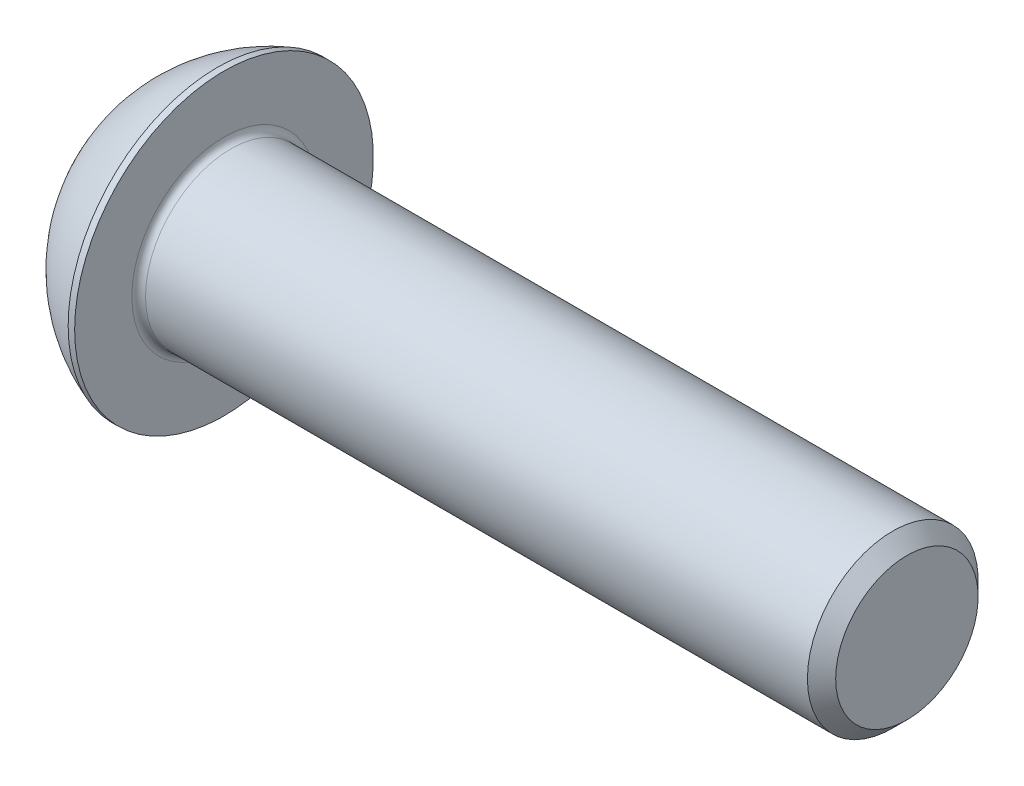
ISO-10303-21;
HEADER;
FILE_DESCRIPTION(('STEP AP214'),'2;1');
FILE_NAME('part.step','',(''),(''),'','','');
FILE_SCHEMA(('AUTOMOTIVE_DESIGN { 1 0 10303 214 1 1 1 1 }'));
ENDSEC;
DATA;
#1=APPLICATION_CONTEXT('core data for automotive mechanical design processes');
#2=APPLICATION_PROTOCOL_DEFINITION('international standard','automotive_design',2000,#1);
#3=PRODUCT_CONTEXT('',#1,'mechanical');
#4=PRODUCT('Part','Part','',(#3));
#5=PRODUCT_RELATED_PRODUCT_CATEGORY('part','',(#4));
#6=PRODUCT_DEFINITION_FORMATION('','',#4);
#7=PRODUCT_DEFINITION_CONTEXT('part definition',#1,'design');
#8=PRODUCT_DEFINITION('design','',#6,#7);
#9=PRODUCT_DEFINITION_SHAPE('','',#8);
#10=(LENGTH_UNIT() NAMED_UNIT(*) SI_UNIT(.MILLI.,.METRE.));
#11=(NAMED_UNIT(*) PLANE_ANGLE_UNIT() SI_UNIT($,.RADIAN.));
#12=(NAMED_UNIT(*) SI_UNIT($,.STERADIAN.) SOLID_ANGLE_UNIT());
#13=UNCERTAINTY_MEASURE_WITH_UNIT(LENGTH_MEASURE(1.E-05),#10,'distance_accuracy_value','');
#14=(GEOMETRIC_REPRESENTATION_CONTEXT(3) GLOBAL_UNCERTAINTY_ASSIGNED_CONTEXT((#13)) GLOBAL_UNIT_ASSIGNED_CONTEXT((#10,
#11,#12)) REPRESENTATION_CONTEXT('',''));
#15=CARTESIAN_POINT('',(0.,0.,0.));
#16=DIRECTION('',(0.,0.,1.));
#17=DIRECTION('',(1.,0.,0.));
#18=AXIS2_PLACEMENT_3D('',#15,#16,#17);
#19=CARTESIAN_POINT('',(0.,0.,0.));
#20=DIRECTION('',(-1.,0.,0.));
#21=DIRECTION('',(0.,0.,1.));
#22=AXIS2_PLACEMENT_3D('',#19,#20,#21);
#23=PLANE('',#22);
#24=CARTESIAN_POINT('',(0.,0.,0.));
#25=DIRECTION('',(-1.,0.,0.));
#26=DIRECTION('',(0.,0.,1.));
#27=AXIS2_PLACEMENT_3D('',#24,#25,#26);
#28=CIRCLE('',#27,4.375);
#29=CARTESIAN_POINT('',(0.,4.375,0.));
#30=VERTEX_POINT('',#29);
#31=EDGE_CURVE('E160',#30,#30,#28,.T.);
#32=ORIENTED_EDGE('',*,*,#31,.T.);
#33=EDGE_LOOP('',(#32));
#34=FACE_BOUND('',#33,.T.);
#35=DIRECTION('',(0.,-1.,0.));
#36=VECTOR('',#35,1.);
#37=CARTESIAN_POINT('',(0.,-1.73205080756888,3.));
#38=LINE('',#37,#36);
#39=CARTESIAN_POINT('',(0.,1.73205080756888,3.));
#40=VERTEX_POINT('',#39);
#41=CARTESIAN_POINT('',(0.,-1.73205080756888,3.));
#42=VERTEX_POINT('',#41);
#43=EDGE_CURVE('E50',#40,#42,#38,.T.);
#44=ORIENTED_EDGE('',*,*,#43,.T.);
#45=DIRECTION('',(0.,-0.5,-0.866025403784439));
#46=VECTOR('',#45,1.);
#47=CARTESIAN_POINT('',(0.,-3.46410161513775,0.));
#48=LINE('',#47,#46);
#49=CARTESIAN_POINT('',(0.,-3.46410161513775,0.));
#50=VERTEX_POINT('',#49);
#51=EDGE_CURVE('E253',#42,#50,#48,.T.);
#52=ORIENTED_EDGE('',*,*,#51,.T.);
#53=DIRECTION('',(0.,0.5,-0.866025403784439));
#54=VECTOR('',#53,1.);
#55=CARTESIAN_POINT('',(0.,-1.73205080756888,-3.));
#56=LINE('',#55,#54);
#57=CARTESIAN_POINT('',(0.,-1.73205080756888,-3.));
#58=VERTEX_POINT('',#57);
#59=EDGE_CURVE('E135',#50,#58,#56,.T.);
#60=ORIENTED_EDGE('',*,*,#59,.T.);
#61=DIRECTION('',(0.,1.,0.));
#62=VECTOR('',#61,1.);
#63=CARTESIAN_POINT('',(0.,1.73205080756888,-3.));
#64=LINE('',#63,#62);
#65=CARTESIAN_POINT('',(0.,1.73205080756888,-3.));
#66=VERTEX_POINT('',#65);
#67=EDGE_CURVE('E256',#58,#66,#64,.T.);
#68=ORIENTED_EDGE('',*,*,#67,.T.);
#69=DIRECTION('',(0.,0.5,0.866025403784439));
#70=VECTOR('',#69,1.);
#71=CARTESIAN_POINT('',(0.,3.46410161513775,0.));
#72=LINE('',#71,#70);
#73=CARTESIAN_POINT('',(0.,3.46410161513775,0.));
#74=VERTEX_POINT('',#73);
#75=EDGE_CURVE('E258',#66,#74,#72,.T.);
#76=ORIENTED_EDGE('',*,*,#75,.T.);
#77=DIRECTION('',(0.,-0.5,0.866025403784439));
#78=VECTOR('',#77,1.);
#79=CARTESIAN_POINT('',(0.,1.73205080756888,3.));
#80=LINE('',#79,#78);
#81=EDGE_CURVE('E260',#74,#40,#80,.T.);
#82=ORIENTED_EDGE('',*,*,#81,.T.);
#83=EDGE_LOOP('',(#44,#52,#60,#68,#76,#82));
#84=FACE_BOUND('',#83,.T.);
#85=ADVANCED_FACE('F35',(#34,#84),#23,.T.);
#86=CARTESIAN_POINT('',(8.16760498046876,0.,0.));
#87=DIRECTION('',(-1.,0.,0.));
#88=DIRECTION('',(0.,1.,0.));
#89=AXIS2_PLACEMENT_3D('',#86,#87,#88);
#90=SPHERICAL_SURFACE('',#89,9.26554888374014);
#91=CARTESIAN_POINT('',(5.12,0.,0.));
#92=DIRECTION('',(-1.,0.,0.));
#93=DIRECTION('',(0.,0.,1.));
#94=AXIS2_PLACEMENT_3D('',#91,#92,#93);
#95=CIRCLE('',#94,8.75);
#96=CARTESIAN_POINT('',(5.12,8.75,0.));
#97=VERTEX_POINT('',#96);
#98=EDGE_CURVE('E157',#97,#97,#95,.T.);
#99=CARTESIAN_POINT('',(5.12,8.75,0.));
#100=CARTESIAN_POINT('',(5.05219861122677,8.72638510285421,0.));
#101=CARTESIAN_POINT('',(4.98467181293709,8.70198184687029,0.));
#102=CARTESIAN_POINT('',(4.8502036366267,8.65161246981684,0.));
#103=CARTESIAN_POINT('',(4.78326225860599,8.62564634874731,0.));
#104=CARTESIAN_POINT('',(4.65000116213544,8.5721650941133,0.));
#105=CARTESIAN_POINT('',(4.5836814436856,8.54464996054882,0.));
#106=CARTESIAN_POINT('',(4.45169948497619,8.48808559682589,0.));
#107=CARTESIAN_POINT('',(4.38603724471662,8.45903636666746,0.));
#108=CARTESIAN_POINT('',(4.25540572844416,8.3994194939892,0.));
#109=CARTESIAN_POINT('',(4.19043645243127,8.36885185146938,0.));
#110=CARTESIAN_POINT('',(4.06122597017269,8.306214675037,0.));
#111=CARTESIAN_POINT('',(3.99698476392699,8.27414514112444,0.));
#112=CARTESIAN_POINT('',(3.86926513493406,8.20852151008421,0.));
#113=CARTESIAN_POINT('',(3.80578671218683,8.17496741295654,0.));
#114=CARTESIAN_POINT('',(3.67962695130739,8.10639278702893,0.));
#115=CARTESIAN_POINT('',(3.61694561317517,8.071372258229,0.));
#116=CARTESIAN_POINT('',(3.49241389204665,7.99988369258837,0.));
#117=CARTESIAN_POINT('',(3.43056350905033,7.96341565574768,0.));
#118=CARTESIAN_POINT('',(3.30772711966809,7.88905177991644,0.));
#119=CARTESIAN_POINT('',(3.24674111328216,7.8511559409259,0.));
#120=CARTESIAN_POINT('',(3.12566643152891,7.77395693819076,0.));
#121=CARTESIAN_POINT('',(3.06557775616159,7.73465377444616,0.));
#122=CARTESIAN_POINT('',(2.94633020596964,7.65466136006695,0.));
#123=CARTESIAN_POINT('',(2.887171331145,7.61397210943232,0.));
#124=CARTESIAN_POINT('',(2.76981534913594,7.53122950812154,0.));
#125=CARTESIAN_POINT('',(2.71161824195152,7.48917615744539,0.));
#126=CARTESIAN_POINT('',(2.59621724261937,7.40372808000575,0.));
#127=CARTESIAN_POINT('',(2.53901335047164,7.36033335324228,0.));
#128=CARTESIAN_POINT('',(2.42562969191559,7.27222597240825,0.));
#129=CARTESIAN_POINT('',(2.36944992550727,7.2275133183377,0.));
#130=CARTESIAN_POINT('',(2.25814487573602,7.13679424382519,0.));
#131=CARTESIAN_POINT('',(2.20301959237308,7.09078782338323,0.));
#132=CARTESIAN_POINT('',(2.093853296198,6.99750607616331,0.));
#133=CARTESIAN_POINT('',(2.03981228338585,6.95023074938535,0.));
#134=CARTESIAN_POINT('',(1.93284372992113,6.85443673519524,0.));
#135=CARTESIAN_POINT('',(1.87991618926856,6.8059180477831,0.));
#136=CARTESIAN_POINT('',(1.77520318005587,6.70766352988896,0.));
#137=CARTESIAN_POINT('',(1.72341771149575,6.65792769940695,0.));
#138=CARTESIAN_POINT('',(1.62101682927054,6.55726577063302,0.));
#139=CARTESIAN_POINT('',(1.57040141560546,6.5063396723411,0.));
#140=CARTESIAN_POINT('',(1.47036799372202,6.40332472638045,0.));
#141=CARTESIAN_POINT('',(1.42094998550366,6.35123587871174,0.));
#142=CARTESIAN_POINT('',(1.3233380780348,6.2459235807343,0.));
#143=CARTESIAN_POINT('',(1.27514417878429,6.19270013042558,0.));
#144=CARTESIAN_POINT('',(1.18000653131406,6.08514738699808,0.));
#145=CARTESIAN_POINT('',(1.13306278309434,6.0308180938793,0.));
#146=CARTESIAN_POINT('',(1.04045080421125,5.92108302221819,0.));
#147=CARTESIAN_POINT('',(0.994782573547891,5.86567724367586,0.));
#148=CARTESIAN_POINT('',(0.904746307085112,5.75381914023211,0.));
#149=CARTESIAN_POINT('',(0.860378271285698,5.69736681533071,0.));
#150=CARTESIAN_POINT('',(0.77296636920711,5.5834461237893,0.));
#151=CARTESIAN_POINT('',(0.729922502927938,5.52597775714929,0.));
#152=CARTESIAN_POINT('',(0.645182199308179,5.4100560356152,0.));
#153=CARTESIAN_POINT('',(0.603485761967592,5.35160268072112,0.));
#154=CARTESIAN_POINT('',(0.521462846462435,5.2337425690253,0.));
#155=CARTESIAN_POINT('',(0.481136368297864,5.17433581222357,0.));
#156=CARTESIAN_POINT('',(0.401875165156513,5.05460099594959,0.));
#157=CARTESIAN_POINT('',(0.362940440179733,4.99427293647735,0.));
#158=CARTESIAN_POINT('',(0.286483770279176,4.87272812047984,0.));
#159=CARTESIAN_POINT('',(0.248961825355399,4.81151136395457,0.));
#160=CARTESIAN_POINT('',(0.17535103536488,4.68822220779421,0.));
#161=CARTESIAN_POINT('',(0.139262190298139,4.62614980815913,0.));
#162=CARTESIAN_POINT('',(0.068536935138992,4.50118300109554,0.));
#163=CARTESIAN_POINT('',(0.0339005250465871,4.43828859366703,0.));
#164=CARTESIAN_POINT('',(0.,4.375,0.));
#165=B_SPLINE_CURVE_WITH_KNOTS('',3,(#99,#100,#101,#102,#103,#104,#105,#106,#107,#108,#109,#110,
#111,#112,#113,#114,#115,#116,#117,#118,#119,#120,#121,#122,#123,#124,#125,#126,#127,#128,#129,
#130,#131,#132,#133,#134,#135,#136,#137,#138,#139,#140,#141,#142,#143,#144,#145,#146,#147,#148,
#149,#150,#151,#152,#153,#154,#155,#156,#157,#158,#159,#160,#161,#162,#163,#164),.UNSPECIFIED.,
.F.,.F.,(4,2,2,2,2,2,2,2,2,2,2,2,2,2,2,2,2,2,2,2,2,2,2,2,2,2,2,2,2,2,2,2,4),(0.,
0.21538368408056,0.430767368161118,0.646151052241677,0.861534736322238,1.0769184204028,
1.29230210448335,1.50768578856391,1.72306947264447,1.93845315672503,2.15383684080559,
2.36922052488615,2.58460420896671,2.79998789304727,3.01537157712783,3.23075526120839,
3.44613894528894,3.6615226293695,3.87690631345006,4.09228999753062,4.30767368161118,
4.52305736569174,4.7384410497723,4.95382473385286,5.16920841793342,5.38459210201397,
5.59997578609453,5.81535947017509,6.03074315425565,6.24612683833621,6.46151052241677,
6.67689420649733,6.89227789057789),.UNSPECIFIED.);
#166=EDGE_CURVE('BSEAM181',#97,#30,#165,.T.);
#167=ORIENTED_EDGE('',*,*,#98,.T.);
#168=ORIENTED_EDGE('',*,*,#31,.F.);
#169=ORIENTED_EDGE('',*,*,#166,.T.);
#170=ORIENTED_EDGE('',*,*,#166,.F.);
#171=EDGE_LOOP('',(#167,#169,#168,#170));
#172=FACE_BOUND('',#171,.T.);
#173=ADVANCED_FACE('F181',(#172),#90,.T.);
#174=CARTESIAN_POINT('',(0.,0.,0.));
#175=DIRECTION('',(-1.,0.,0.));
#176=DIRECTION('',(0.,0.,1.));
#177=AXIS2_PLACEMENT_3D('',#174,#175,#176);
#178=CYLINDRICAL_SURFACE('',#177,8.75);
#179=ORIENTED_EDGE('',*,*,#98,.F.);
#180=EDGE_LOOP('',(#179));
#181=FACE_BOUND('',#180,.T.);
#182=CARTESIAN_POINT('',(5.5,0.,0.));
#183=DIRECTION('',(-1.,0.,0.));
#184=DIRECTION('',(0.,0.,1.));
#185=AXIS2_PLACEMENT_3D('',#182,#183,#184);
#186=CIRCLE('',#185,8.75);
#187=CARTESIAN_POINT('',(5.5,0.,8.75));
#188=VERTEX_POINT('',#187);
#189=EDGE_CURVE('E154',#188,#188,#186,.T.);
#190=ORIENTED_EDGE('',*,*,#189,.T.);
#191=EDGE_LOOP('',(#190));
#192=FACE_BOUND('',#191,.T.);
#193=ADVANCED_FACE('F186',(#181,#192),#178,.T.);
#194=CARTESIAN_POINT('',(5.5,5.,0.));
#195=DIRECTION('',(-1.,0.,0.));
#196=DIRECTION('',(0.,0.,1.));
#197=AXIS2_PLACEMENT_3D('',#194,#195,#196);
#198=PLANE('',#197);
#199=CARTESIAN_POINT('',(5.5,0.,0.));
#200=DIRECTION('',(-1.,0.,0.));
#201=DIRECTION('',(0.,0.,1.));
#202=AXIS2_PLACEMENT_3D('',#199,#200,#201);
#203=CIRCLE('',#202,5.4);
#204=CARTESIAN_POINT('',(5.5,0.,5.4));
#205=VERTEX_POINT('',#204);
#206=EDGE_CURVE('E43',#205,#205,#203,.T.);
#207=ORIENTED_EDGE('',*,*,#206,.T.);
#208=EDGE_LOOP('',(#207));
#209=FACE_BOUND('',#208,.T.);
#210=ORIENTED_EDGE('',*,*,#189,.F.);
#211=EDGE_LOOP('',(#210));
#212=FACE_BOUND('',#211,.T.);
#213=ADVANCED_FACE('F165',(#209,#212),#198,.F.);
#214=CARTESIAN_POINT('',(0.,0.,0.));
#215=DIRECTION('',(-1.,0.,0.));
#216=DIRECTION('',(0.,0.,1.));
#217=AXIS2_PLACEMENT_3D('',#214,#215,#216);
#218=CYLINDRICAL_SURFACE('',#217,5.);
#219=CARTESIAN_POINT('',(5.9,0.,0.));
#220=DIRECTION('',(-1.,0.,0.));
#221=DIRECTION('',(0.,0.,1.));
#222=AXIS2_PLACEMENT_3D('',#219,#220,#221);
#223=CIRCLE('',#222,5.);
#224=CARTESIAN_POINT('',(5.9,0.,5.));
#225=VERTEX_POINT('',#224);
#226=EDGE_CURVE('E11',#225,#225,#223,.F.);
#227=ORIENTED_EDGE('',*,*,#226,.T.);
#228=EDGE_LOOP('',(#227));
#229=FACE_BOUND('',#228,.T.);
#230=CARTESIAN_POINT('',(44.672,0.,0.));
#231=DIRECTION('',(-1.,0.,0.));
#232=DIRECTION('',(0.,0.,1.));
#233=AXIS2_PLACEMENT_3D('',#230,#231,#232);
#234=CIRCLE('',#233,5.);
#235=CARTESIAN_POINT('',(44.672,0.,5.));
#236=VERTEX_POINT('',#235);
#237=EDGE_CURVE('E151',#236,#236,#234,.T.);
#238=ORIENTED_EDGE('',*,*,#237,.T.);
#239=EDGE_LOOP('',(#238));
#240=FACE_BOUND('',#239,.T.);
#241=ADVANCED_FACE('F195',(#229,#240),#218,.T.);
#242=CARTESIAN_POINT('',(45.5,0.,0.));
#243=DIRECTION('',(-1.,0.,0.));
#244=DIRECTION('',(0.,0.,1.));
#245=AXIS2_PLACEMENT_3D('',#242,#243,#244);
#246=CONICAL_SURFACE('',#245,4.172,0.785398163397447);
#247=ORIENTED_EDGE('',*,*,#237,.F.);
#248=EDGE_LOOP('',(#247));
#249=FACE_BOUND('',#248,.T.);
#250=CARTESIAN_POINT('',(45.5,0.,0.));
#251=DIRECTION('',(-1.,0.,0.));
#252=DIRECTION('',(0.,0.,1.));
#253=AXIS2_PLACEMENT_3D('',#250,#251,#252);
#254=CIRCLE('',#253,4.172);
#255=CARTESIAN_POINT('',(45.5,0.,4.172));
#256=VERTEX_POINT('',#255);
#257=EDGE_CURVE('E147',#256,#256,#254,.T.);
#258=ORIENTED_EDGE('',*,*,#257,.T.);
#259=EDGE_LOOP('',(#258));
#260=FACE_BOUND('',#259,.T.);
#261=ADVANCED_FACE('F176',(#249,#260),#246,.T.);
#262=CARTESIAN_POINT('',(45.5,0.,0.));
#263=DIRECTION('',(-1.,0.,0.));
#264=DIRECTION('',(0.,0.,1.));
#265=AXIS2_PLACEMENT_3D('',#262,#263,#264);
#266=PLANE('',#265);
#267=ORIENTED_EDGE('',*,*,#257,.F.);
#268=EDGE_LOOP('',(#267));
#269=FACE_BOUND('',#268,.T.);
#270=ADVANCED_FACE('F169',(#269),#266,.F.);
#271=CARTESIAN_POINT('',(5.9,0.,0.));
#272=DIRECTION('',(-1.,0.,0.));
#273=DIRECTION('',(0.,0.,1.));
#274=AXIS2_PLACEMENT_3D('',#271,#272,#273);
#275=TOROIDAL_SURFACE('',#274,5.4,0.4);
#276=ORIENTED_EDGE('',*,*,#226,.F.);
#277=EDGE_LOOP('',(#276));
#278=FACE_BOUND('',#277,.T.);
#279=ORIENTED_EDGE('',*,*,#206,.F.);
#280=EDGE_LOOP('',(#279));
#281=FACE_BOUND('',#280,.T.);
#282=ADVANCED_FACE('F37',(#278,#281),#275,.F.);
#283=CARTESIAN_POINT('',(3.12,-3.46410161513775,0.));
#284=DIRECTION('',(0.,0.866025403784439,-0.5));
#285=DIRECTION('',(0.,0.5,0.866025403784439));
#286=AXIS2_PLACEMENT_3D('',#283,#284,#285);
#287=PLANE('',#286);
#288=DIRECTION('',(0.,-0.5,-0.866025403784439));
#289=VECTOR('',#288,1.);
#290=CARTESIAN_POINT('',(3.12,-3.46410161513775,0.));
#291=LINE('',#290,#289);
#292=CARTESIAN_POINT('',(3.12,-1.73205080756888,3.));
#293=VERTEX_POINT('',#292);
#294=CARTESIAN_POINT('',(3.12,-2.59807621135332,1.5));
#295=VERTEX_POINT('',#294);
#296=EDGE_CURVE('E118',#293,#295,#291,.T.);
#297=ORIENTED_EDGE('',*,*,#296,.T.);
#298=CARTESIAN_POINT('',(3.12,-3.46410161513775,0.));
#299=VERTEX_POINT('',#298);
#300=EDGE_CURVE('E111',#295,#299,#291,.T.);
#301=ORIENTED_EDGE('',*,*,#300,.T.);
#302=DIRECTION('',(-1.,0.,0.));
#303=VECTOR('',#302,1.);
#304=CARTESIAN_POINT('',(3.12,-3.46410161513775,0.));
#305=LINE('',#304,#303);
#306=EDGE_CURVE('E115',#299,#50,#305,.T.);
#307=ORIENTED_EDGE('',*,*,#306,.T.);
#308=ORIENTED_EDGE('',*,*,#51,.F.);
#309=DIRECTION('',(-1.,0.,0.));
#310=VECTOR('',#309,1.);
#311=CARTESIAN_POINT('',(3.12,-1.73205080756888,3.));
#312=LINE('',#311,#310);
#313=EDGE_CURVE('E243',#293,#42,#312,.T.);
#314=ORIENTED_EDGE('',*,*,#313,.F.);
#315=EDGE_LOOP('',(#297,#301,#307,#308,#314));
#316=FACE_BOUND('',#315,.T.);
#317=ADVANCED_FACE('F113',(#316),#287,.T.);
#318=CARTESIAN_POINT('',(3.12,-1.73205080756888,-3.));
#319=DIRECTION('',(0.,0.866025403784439,0.5));
#320=DIRECTION('',(0.,-0.5,0.866025403784439));
#321=AXIS2_PLACEMENT_3D('',#318,#319,#320);
#322=PLANE('',#321);
#323=DIRECTION('',(0.,0.5,-0.866025403784439));
#324=VECTOR('',#323,1.);
#325=CARTESIAN_POINT('',(3.12,-1.73205080756888,-3.));
#326=LINE('',#325,#324);
#327=CARTESIAN_POINT('',(3.12,-2.59807621135332,-1.5));
#328=VERTEX_POINT('',#327);
#329=EDGE_CURVE('E123',#299,#328,#326,.T.);
#330=ORIENTED_EDGE('',*,*,#329,.T.);
#331=CARTESIAN_POINT('',(3.12,-1.73205080756888,-3.));
#332=VERTEX_POINT('',#331);
#333=EDGE_CURVE('E130',#328,#332,#326,.T.);
#334=ORIENTED_EDGE('',*,*,#333,.T.);
#335=DIRECTION('',(-1.,0.,0.));
#336=VECTOR('',#335,1.);
#337=CARTESIAN_POINT('',(3.12,-1.73205080756888,-3.));
#338=LINE('',#337,#336);
#339=EDGE_CURVE('E137',#332,#58,#338,.T.);
#340=ORIENTED_EDGE('',*,*,#339,.T.);
#341=ORIENTED_EDGE('',*,*,#59,.F.);
#342=ORIENTED_EDGE('',*,*,#306,.F.);
#343=EDGE_LOOP('',(#330,#334,#340,#341,#342));
#344=FACE_BOUND('',#343,.T.);
#345=ADVANCED_FACE('F133',(#344),#322,.T.);
#346=CARTESIAN_POINT('',(3.12,1.73205080756888,-3.));
#347=DIRECTION('',(0.,0.,1.));
#348=DIRECTION('',(1.,0.,0.));
#349=AXIS2_PLACEMENT_3D('',#346,#347,#348);
#350=PLANE('',#349);
#351=DIRECTION('',(0.,1.,0.));
#352=VECTOR('',#351,1.);
#353=CARTESIAN_POINT('',(3.12,1.73205080756888,-3.));
#354=LINE('',#353,#352);
#355=CARTESIAN_POINT('',(3.12,0.,-3.));
#356=VERTEX_POINT('',#355);
#357=EDGE_CURVE('E279',#332,#356,#354,.T.);
#358=ORIENTED_EDGE('',*,*,#357,.T.);
#359=CARTESIAN_POINT('',(3.12,1.73205080756888,-3.));
#360=VERTEX_POINT('',#359);
#361=EDGE_CURVE('E129',#356,#360,#354,.T.);
#362=ORIENTED_EDGE('',*,*,#361,.T.);
#363=DIRECTION('',(-1.,0.,0.));
#364=VECTOR('',#363,1.);
#365=CARTESIAN_POINT('',(3.12,1.73205080756888,-3.));
#366=LINE('',#365,#364);
#367=EDGE_CURVE('E142',#360,#66,#366,.T.);
#368=ORIENTED_EDGE('',*,*,#367,.T.);
#369=ORIENTED_EDGE('',*,*,#67,.F.);
#370=ORIENTED_EDGE('',*,*,#339,.F.);
#371=EDGE_LOOP('',(#358,#362,#368,#369,#370));
#372=FACE_BOUND('',#371,.T.);
#373=ADVANCED_FACE('F209',(#372),#350,.T.);
#374=CARTESIAN_POINT('',(3.12,3.46410161513775,0.));
#375=DIRECTION('',(0.,-0.866025403784439,0.5));
#376=DIRECTION('',(0.,-0.5,-0.866025403784439));
#377=AXIS2_PLACEMENT_3D('',#374,#375,#376);
#378=PLANE('',#377);
#379=DIRECTION('',(0.,0.5,0.866025403784439));
#380=VECTOR('',#379,1.);
#381=CARTESIAN_POINT('',(3.12,3.46410161513775,0.));
#382=LINE('',#381,#380);
#383=CARTESIAN_POINT('',(3.12,2.59807621135332,-1.5));
#384=VERTEX_POINT('',#383);
#385=EDGE_CURVE('E285',#360,#384,#382,.T.);
#386=ORIENTED_EDGE('',*,*,#385,.T.);
#387=CARTESIAN_POINT('',(3.12,3.46410161513775,0.));
#388=VERTEX_POINT('',#387);
#389=EDGE_CURVE('E283',#384,#388,#382,.T.);
#390=ORIENTED_EDGE('',*,*,#389,.T.);
#391=DIRECTION('',(-1.,0.,0.));
#392=VECTOR('',#391,1.);
#393=CARTESIAN_POINT('',(3.12,3.46410161513775,0.));
#394=LINE('',#393,#392);
#395=EDGE_CURVE('E265',#388,#74,#394,.T.);
#396=ORIENTED_EDGE('',*,*,#395,.T.);
#397=ORIENTED_EDGE('',*,*,#75,.F.);
#398=ORIENTED_EDGE('',*,*,#367,.F.);
#399=EDGE_LOOP('',(#386,#390,#396,#397,#398));
#400=FACE_BOUND('',#399,.T.);
#401=ADVANCED_FACE('F212',(#400),#378,.T.);
#402=CARTESIAN_POINT('',(3.12,1.73205080756888,3.));
#403=DIRECTION('',(0.,-0.866025403784439,-0.5));
#404=DIRECTION('',(0.,0.5,-0.866025403784439));
#405=AXIS2_PLACEMENT_3D('',#402,#403,#404);
#406=PLANE('',#405);
#407=DIRECTION('',(0.,-0.5,0.866025403784439));
#408=VECTOR('',#407,1.);
#409=CARTESIAN_POINT('',(3.12,1.73205080756888,3.));
#410=LINE('',#409,#408);
#411=CARTESIAN_POINT('',(3.12,2.59807621135332,1.5));
#412=VERTEX_POINT('',#411);
#413=EDGE_CURVE('E249',#388,#412,#410,.T.);
#414=ORIENTED_EDGE('',*,*,#413,.T.);
#415=CARTESIAN_POINT('',(3.12,1.73205080756888,3.));
#416=VERTEX_POINT('',#415);
#417=EDGE_CURVE('E241',#412,#416,#410,.T.);
#418=ORIENTED_EDGE('',*,*,#417,.T.);
#419=DIRECTION('',(-1.,0.,0.));
#420=VECTOR('',#419,1.);
#421=CARTESIAN_POINT('',(3.12,1.73205080756888,3.));
#422=LINE('',#421,#420);
#423=EDGE_CURVE('E247',#416,#40,#422,.T.);
#424=ORIENTED_EDGE('',*,*,#423,.T.);
#425=ORIENTED_EDGE('',*,*,#81,.F.);
#426=ORIENTED_EDGE('',*,*,#395,.F.);
#427=EDGE_LOOP('',(#414,#418,#424,#425,#426));
#428=FACE_BOUND('',#427,.T.);
#429=ADVANCED_FACE('F216',(#428),#406,.T.);
#430=CARTESIAN_POINT('',(3.12,-1.73205080756888,3.));
#431=DIRECTION('',(0.,0.,-1.));
#432=DIRECTION('',(0.,1.,0.));
#433=AXIS2_PLACEMENT_3D('',#430,#431,#432);
#434=PLANE('',#433);
#435=DIRECTION('',(0.,-1.,0.));
#436=VECTOR('',#435,1.);
#437=CARTESIAN_POINT('',(3.12,-1.73205080756888,3.));
#438=LINE('',#437,#436);
#439=CARTESIAN_POINT('',(3.12,0.,3.));
#440=VERTEX_POINT('',#439);
#441=EDGE_CURVE('E58',#416,#440,#438,.T.);
#442=ORIENTED_EDGE('',*,*,#441,.T.);
#443=EDGE_CURVE('E244',#440,#293,#438,.T.);
#444=ORIENTED_EDGE('',*,*,#443,.T.);
#445=ORIENTED_EDGE('',*,*,#313,.T.);
#446=ORIENTED_EDGE('',*,*,#43,.F.);
#447=ORIENTED_EDGE('',*,*,#423,.F.);
#448=EDGE_LOOP('',(#442,#444,#445,#446,#447));
#449=FACE_BOUND('',#448,.T.);
#450=ADVANCED_FACE('F220',(#449),#434,.T.);
#451=CARTESIAN_POINT('',(3.12,-1.73205080756888,3.));
#452=DIRECTION('',(-1.,0.,0.));
#453=DIRECTION('',(0.,0.,1.));
#454=AXIS2_PLACEMENT_3D('',#451,#452,#453);
#455=PLANE('',#454);
#456=ORIENTED_EDGE('',*,*,#441,.F.);
#457=ORIENTED_EDGE('',*,*,#417,.F.);
#458=CARTESIAN_POINT('',(3.12,0.,0.));
#459=DIRECTION('',(-1.,0.,0.));
#460=DIRECTION('',(0.,0.,1.));
#461=AXIS2_PLACEMENT_3D('',#458,#459,#460);
#462=CIRCLE('',#461,3.);
#463=EDGE_CURVE('E141',#440,#412,#462,.T.);
#464=ORIENTED_EDGE('',*,*,#463,.F.);
#465=EDGE_LOOP('',(#456,#457,#464));
#466=FACE_BOUND('',#465,.T.);
#467=ADVANCED_FACE('F224',(#466),#455,.T.);
#468=ORIENTED_EDGE('',*,*,#413,.F.);
#469=ORIENTED_EDGE('',*,*,#389,.F.);
#470=EDGE_CURVE('E148',#412,#384,#462,.T.);
#471=ORIENTED_EDGE('',*,*,#470,.F.);
#472=EDGE_LOOP('',(#468,#469,#471));
#473=FACE_BOUND('',#472,.T.);
#474=ADVANCED_FACE('F232',(#473),#455,.T.);
#475=ORIENTED_EDGE('',*,*,#385,.F.);
#476=ORIENTED_EDGE('',*,*,#361,.F.);
#477=EDGE_CURVE('E290',#384,#356,#462,.T.);
#478=ORIENTED_EDGE('',*,*,#477,.F.);
#479=EDGE_LOOP('',(#475,#476,#478));
#480=FACE_BOUND('',#479,.T.);
#481=ADVANCED_FACE('F237',(#480),#455,.T.);
#482=ORIENTED_EDGE('',*,*,#357,.F.);
#483=ORIENTED_EDGE('',*,*,#333,.F.);
#484=EDGE_CURVE('E282',#356,#328,#462,.T.);
#485=ORIENTED_EDGE('',*,*,#484,.F.);
#486=EDGE_LOOP('',(#482,#483,#485));
#487=FACE_BOUND('',#486,.T.);
#488=ADVANCED_FACE('F230',(#487),#455,.T.);
#489=ORIENTED_EDGE('',*,*,#329,.F.);
#490=ORIENTED_EDGE('',*,*,#300,.F.);
#491=EDGE_CURVE('E125',#328,#295,#462,.T.);
#492=ORIENTED_EDGE('',*,*,#491,.F.);
#493=EDGE_LOOP('',(#489,#490,#492));
#494=FACE_BOUND('',#493,.T.);
#495=ADVANCED_FACE('F124',(#494),#455,.T.);
#496=ORIENTED_EDGE('',*,*,#296,.F.);
#497=ORIENTED_EDGE('',*,*,#443,.F.);
#498=EDGE_CURVE('E136',#295,#440,#462,.T.);
#499=ORIENTED_EDGE('',*,*,#498,.F.);
#500=EDGE_LOOP('',(#496,#497,#499));
#501=FACE_BOUND('',#500,.T.);
#502=ADVANCED_FACE('F204',(#501),#455,.T.);
#503=CARTESIAN_POINT('',(4.8520508075689,0.,0.));
#504=DIRECTION('',(-1.,0.,0.));
#505=DIRECTION('',(0.,0.,1.));
#506=AXIS2_PLACEMENT_3D('',#503,#504,#505);
#507=CONICAL_SURFACE('',#506,0.,1.04719755119659);
#508=ORIENTED_EDGE('',*,*,#463,.T.);
#509=ORIENTED_EDGE('',*,*,#470,.T.);
#510=ORIENTED_EDGE('',*,*,#477,.T.);
#511=ORIENTED_EDGE('',*,*,#484,.T.);
#512=ORIENTED_EDGE('',*,*,#491,.T.);
#513=ORIENTED_EDGE('',*,*,#498,.T.);
#514=EDGE_LOOP('',(#508,#509,#510,#511,#512,#513));
#515=FACE_BOUND('',#514,.T.);
#516=CARTESIAN_POINT('',(4.8520508075689,0.,0.));
#517=VERTEX_POINT('',#516);
#518=VERTEX_LOOP('',#517);
#519=FACE_BOUND('',#518,.T.);
#520=ADVANCED_FACE('F202',(#515,#519),#507,.F.);
#521=CLOSED_SHELL('',(#85,#173,#193,#213,#241,#261,#270,#282,#317,#345,#373,#401,#429,#450,#467,
#474,#481,#488,#495,#502,#520));
#522=MANIFOLD_SOLID_BREP('B2',#521);
#523=ADVANCED_BREP_SHAPE_REPRESENTATION('',(#18,#522),#14);
#524=SHAPE_DEFINITION_REPRESENTATION(#9,#523);
ENDSEC;
END-ISO-10303-21;
